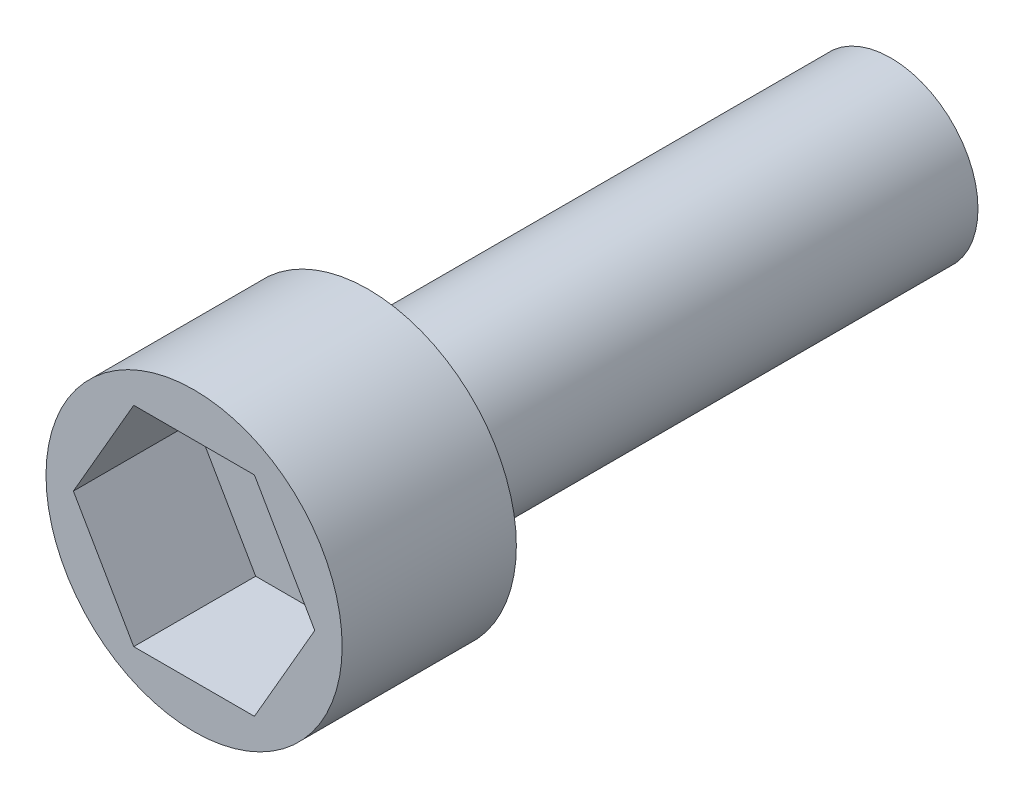
ISO-10303-21;
HEADER;
FILE_DESCRIPTION(('STEP AP214'),'2;1');
FILE_NAME('part.step','',(''),(''),'','','');
FILE_SCHEMA(('AUTOMOTIVE_DESIGN { 1 0 10303 214 1 1 1 1 }'));
ENDSEC;
DATA;
#1=APPLICATION_CONTEXT('core data for automotive mechanical design processes');
#2=APPLICATION_PROTOCOL_DEFINITION('international standard','automotive_design',2000,#1);
#3=PRODUCT_CONTEXT('',#1,'mechanical');
#4=PRODUCT('Part','Part','',(#3));
#5=PRODUCT_RELATED_PRODUCT_CATEGORY('part','',(#4));
#6=PRODUCT_DEFINITION_FORMATION('','',#4);
#7=PRODUCT_DEFINITION_CONTEXT('part definition',#1,'design');
#8=PRODUCT_DEFINITION('design','',#6,#7);
#9=PRODUCT_DEFINITION_SHAPE('','',#8);
#10=(LENGTH_UNIT() NAMED_UNIT(*) SI_UNIT(.MILLI.,.METRE.));
#11=(NAMED_UNIT(*) PLANE_ANGLE_UNIT() SI_UNIT($,.RADIAN.));
#12=(NAMED_UNIT(*) SI_UNIT($,.STERADIAN.) SOLID_ANGLE_UNIT());
#13=UNCERTAINTY_MEASURE_WITH_UNIT(LENGTH_MEASURE(1.E-05),#10,'distance_accuracy_value','');
#14=(GEOMETRIC_REPRESENTATION_CONTEXT(3) GLOBAL_UNCERTAINTY_ASSIGNED_CONTEXT((#13)) GLOBAL_UNIT_ASSIGNED_CONTEXT((#10,
#11,#12)) REPRESENTATION_CONTEXT('',''));
#15=CARTESIAN_POINT('',(0.,0.,0.));
#16=DIRECTION('',(0.,0.,1.));
#17=DIRECTION('',(1.,0.,0.));
#18=AXIS2_PLACEMENT_3D('',#15,#16,#17);
#19=CARTESIAN_POINT('',(0.,0.,15.));
#20=DIRECTION('',(0.,0.,-1.));
#21=DIRECTION('',(-1.,0.,0.));
#22=AXIS2_PLACEMENT_3D('',#19,#20,#21);
#23=CYLINDRICAL_SURFACE('',#22,2.5);
#24=CARTESIAN_POINT('',(0.,0.,15.));
#25=DIRECTION('',(0.,0.,1.));
#26=DIRECTION('',(1.,0.,0.));
#27=AXIS2_PLACEMENT_3D('',#24,#25,#26);
#28=CIRCLE('',#27,2.5);
#29=CARTESIAN_POINT('',(2.5,0.,15.));
#30=VERTEX_POINT('',#29);
#31=EDGE_CURVE('E11',#30,#30,#28,.T.);
#32=ORIENTED_EDGE('',*,*,#31,.F.);
#33=EDGE_LOOP('',(#32));
#34=FACE_BOUND('',#33,.T.);
#35=CARTESIAN_POINT('',(0.,0.,0.));
#36=DIRECTION('',(0.,0.,1.));
#37=DIRECTION('',(1.,0.,0.));
#38=AXIS2_PLACEMENT_3D('',#35,#36,#37);
#39=CIRCLE('',#38,2.5);
#40=CARTESIAN_POINT('',(2.5,0.,0.));
#41=VERTEX_POINT('',#40);
#42=EDGE_CURVE('E44',#41,#41,#39,.T.);
#43=ORIENTED_EDGE('',*,*,#42,.T.);
#44=EDGE_LOOP('',(#43));
#45=FACE_BOUND('',#44,.T.);
#46=ADVANCED_FACE('F41',(#34,#45),#23,.T.);
#47=CARTESIAN_POINT('',(0.,0.,0.));
#48=DIRECTION('',(0.,0.,1.));
#49=DIRECTION('',(1.,0.,0.));
#50=AXIS2_PLACEMENT_3D('',#47,#48,#49);
#51=PLANE('',#50);
#52=ORIENTED_EDGE('',*,*,#42,.F.);
#53=EDGE_LOOP('',(#52));
#54=FACE_BOUND('',#53,.T.);
#55=ADVANCED_FACE('F191',(#54),#51,.F.);
#56=CARTESIAN_POINT('',(0.,0.,20.));
#57=DIRECTION('',(0.,0.,-1.));
#58=DIRECTION('',(-1.,0.,0.));
#59=AXIS2_PLACEMENT_3D('',#56,#57,#58);
#60=CYLINDRICAL_SURFACE('',#59,4.25);
#61=CARTESIAN_POINT('',(0.,0.,20.));
#62=DIRECTION('',(0.,0.,1.));
#63=DIRECTION('',(1.,0.,0.));
#64=AXIS2_PLACEMENT_3D('',#61,#62,#63);
#65=CIRCLE('',#64,4.25);
#66=CARTESIAN_POINT('',(4.25,0.,20.));
#67=VERTEX_POINT('',#66);
#68=EDGE_CURVE('E165',#67,#67,#65,.T.);
#69=ORIENTED_EDGE('',*,*,#68,.F.);
#70=EDGE_LOOP('',(#69));
#71=FACE_BOUND('',#70,.T.);
#72=CARTESIAN_POINT('',(0.,0.,15.));
#73=DIRECTION('',(0.,0.,1.));
#74=DIRECTION('',(1.,0.,0.));
#75=AXIS2_PLACEMENT_3D('',#72,#73,#74);
#76=CIRCLE('',#75,4.25);
#77=CARTESIAN_POINT('',(4.25,0.,15.));
#78=VERTEX_POINT('',#77);
#79=EDGE_CURVE('E155',#78,#78,#76,.T.);
#80=ORIENTED_EDGE('',*,*,#79,.T.);
#81=EDGE_LOOP('',(#80));
#82=FACE_BOUND('',#81,.T.);
#83=ADVANCED_FACE('F173',(#71,#82),#60,.T.);
#84=CARTESIAN_POINT('',(0.,0.,20.));
#85=DIRECTION('',(0.,0.,1.));
#86=DIRECTION('',(1.,0.,0.));
#87=AXIS2_PLACEMENT_3D('',#84,#85,#86);
#88=PLANE('',#87);
#89=DIRECTION('',(0.5,0.866025403784439,0.));
#90=VECTOR('',#89,1.);
#91=CARTESIAN_POINT('',(1.73205080756888,-3.,20.));
#92=LINE('',#91,#90);
#93=CARTESIAN_POINT('',(1.73205080756888,-3.,20.));
#94=VERTEX_POINT('',#93);
#95=CARTESIAN_POINT('',(3.46410161513775,0.,20.));
#96=VERTEX_POINT('',#95);
#97=EDGE_CURVE('E56',#94,#96,#92,.T.);
#98=ORIENTED_EDGE('',*,*,#97,.F.);
#99=DIRECTION('',(1.,0.,0.));
#100=VECTOR('',#99,1.);
#101=CARTESIAN_POINT('',(-1.73205080756888,-3.,20.));
#102=LINE('',#101,#100);
#103=CARTESIAN_POINT('',(-1.73205080756888,-3.,20.));
#104=VERTEX_POINT('',#103);
#105=EDGE_CURVE('E149',#104,#94,#102,.T.);
#106=ORIENTED_EDGE('',*,*,#105,.F.);
#107=DIRECTION('',(0.5,-0.866025403784439,0.));
#108=VECTOR('',#107,1.);
#109=CARTESIAN_POINT('',(-3.46410161513775,0.,20.));
#110=LINE('',#109,#108);
#111=CARTESIAN_POINT('',(-3.46410161513775,0.,20.));
#112=VERTEX_POINT('',#111);
#113=EDGE_CURVE('E146',#112,#104,#110,.T.);
#114=ORIENTED_EDGE('',*,*,#113,.F.);
#115=DIRECTION('',(-0.5,-0.866025403784439,0.));
#116=VECTOR('',#115,1.);
#117=CARTESIAN_POINT('',(-1.73205080756888,3.,20.));
#118=LINE('',#117,#116);
#119=CARTESIAN_POINT('',(-1.73205080756888,3.,20.));
#120=VERTEX_POINT('',#119);
#121=EDGE_CURVE('E104',#120,#112,#118,.T.);
#122=ORIENTED_EDGE('',*,*,#121,.F.);
#123=DIRECTION('',(-1.,0.,0.));
#124=VECTOR('',#123,1.);
#125=CARTESIAN_POINT('',(1.73205080756888,3.,20.));
#126=LINE('',#125,#124);
#127=CARTESIAN_POINT('',(1.73205080756888,3.,20.));
#128=VERTEX_POINT('',#127);
#129=EDGE_CURVE('E140',#128,#120,#126,.T.);
#130=ORIENTED_EDGE('',*,*,#129,.F.);
#131=DIRECTION('',(-0.5,0.866025403784438,0.));
#132=VECTOR('',#131,1.);
#133=CARTESIAN_POINT('',(3.46410161513775,0.,20.));
#134=LINE('',#133,#132);
#135=EDGE_CURVE('E136',#96,#128,#134,.T.);
#136=ORIENTED_EDGE('',*,*,#135,.F.);
#137=EDGE_LOOP('',(#98,#106,#114,#122,#130,#136));
#138=FACE_BOUND('',#137,.T.);
#139=ORIENTED_EDGE('',*,*,#68,.T.);
#140=EDGE_LOOP('',(#139));
#141=FACE_BOUND('',#140,.T.);
#142=ADVANCED_FACE('F178',(#138,#141),#88,.T.);
#143=CARTESIAN_POINT('',(0.,0.,15.));
#144=DIRECTION('',(0.,0.,1.));
#145=DIRECTION('',(1.,0.,0.));
#146=AXIS2_PLACEMENT_3D('',#143,#144,#145);
#147=PLANE('',#146);
#148=ORIENTED_EDGE('',*,*,#31,.T.);
#149=EDGE_LOOP('',(#148));
#150=FACE_BOUND('',#149,.T.);
#151=ORIENTED_EDGE('',*,*,#79,.F.);
#152=EDGE_LOOP('',(#151));
#153=FACE_BOUND('',#152,.T.);
#154=ADVANCED_FACE('F175',(#150,#153),#147,.F.);
#155=CARTESIAN_POINT('',(1.73205080756888,-3.,16.5));
#156=DIRECTION('',(0.866025403784439,-0.5,0.));
#157=DIRECTION('',(0.5,0.866025403784439,0.));
#158=AXIS2_PLACEMENT_3D('',#155,#156,#157);
#159=PLANE('',#158);
#160=ORIENTED_EDGE('',*,*,#97,.T.);
#161=DIRECTION('',(0.,0.,1.));
#162=VECTOR('',#161,1.);
#163=CARTESIAN_POINT('',(3.46410161513775,0.,16.5));
#164=LINE('',#163,#162);
#165=CARTESIAN_POINT('',(3.46410161513775,0.,16.5));
#166=VERTEX_POINT('',#165);
#167=EDGE_CURVE('E86',#166,#96,#164,.T.);
#168=ORIENTED_EDGE('',*,*,#167,.F.);
#169=DIRECTION('',(0.5,0.866025403784439,0.));
#170=VECTOR('',#169,1.);
#171=CARTESIAN_POINT('',(1.73205080756888,-3.,16.5));
#172=LINE('',#171,#170);
#173=CARTESIAN_POINT('',(1.73205080756888,-3.,16.5));
#174=VERTEX_POINT('',#173);
#175=EDGE_CURVE('E152',#174,#166,#172,.T.);
#176=ORIENTED_EDGE('',*,*,#175,.F.);
#177=DIRECTION('',(0.,0.,1.));
#178=VECTOR('',#177,1.);
#179=CARTESIAN_POINT('',(1.73205080756888,-3.,16.5));
#180=LINE('',#179,#178);
#181=EDGE_CURVE('E64',#174,#94,#180,.T.);
#182=ORIENTED_EDGE('',*,*,#181,.T.);
#183=EDGE_LOOP('',(#160,#168,#176,#182));
#184=FACE_BOUND('',#183,.T.);
#185=ADVANCED_FACE('F177',(#184),#159,.F.);
#186=CARTESIAN_POINT('',(-1.73205080756888,-3.,16.5));
#187=DIRECTION('',(0.,-1.,0.));
#188=DIRECTION('',(0.,0.,-1.));
#189=AXIS2_PLACEMENT_3D('',#186,#187,#188);
#190=PLANE('',#189);
#191=ORIENTED_EDGE('',*,*,#105,.T.);
#192=ORIENTED_EDGE('',*,*,#181,.F.);
#193=DIRECTION('',(1.,0.,0.));
#194=VECTOR('',#193,1.);
#195=CARTESIAN_POINT('',(-1.73205080756888,-3.,16.5));
#196=LINE('',#195,#194);
#197=CARTESIAN_POINT('',(-1.73205080756888,-3.,16.5));
#198=VERTEX_POINT('',#197);
#199=EDGE_CURVE('E118',#198,#174,#196,.T.);
#200=ORIENTED_EDGE('',*,*,#199,.F.);
#201=DIRECTION('',(0.,0.,1.));
#202=VECTOR('',#201,1.);
#203=CARTESIAN_POINT('',(-1.73205080756888,-3.,16.5));
#204=LINE('',#203,#202);
#205=EDGE_CURVE('E109',#198,#104,#204,.T.);
#206=ORIENTED_EDGE('',*,*,#205,.T.);
#207=EDGE_LOOP('',(#191,#192,#200,#206));
#208=FACE_BOUND('',#207,.T.);
#209=ADVANCED_FACE('F185',(#208),#190,.F.);
#210=CARTESIAN_POINT('',(-3.46410161513775,0.,16.5));
#211=DIRECTION('',(-0.866025403784439,-0.5,0.));
#212=DIRECTION('',(0.5,-0.866025403784439,0.));
#213=AXIS2_PLACEMENT_3D('',#210,#211,#212);
#214=PLANE('',#213);
#215=ORIENTED_EDGE('',*,*,#113,.T.);
#216=ORIENTED_EDGE('',*,*,#205,.F.);
#217=DIRECTION('',(0.5,-0.866025403784439,0.));
#218=VECTOR('',#217,1.);
#219=CARTESIAN_POINT('',(-3.46410161513775,0.,16.5));
#220=LINE('',#219,#218);
#221=CARTESIAN_POINT('',(-3.46410161513775,0.,16.5));
#222=VERTEX_POINT('',#221);
#223=EDGE_CURVE('E113',#222,#198,#220,.T.);
#224=ORIENTED_EDGE('',*,*,#223,.F.);
#225=DIRECTION('',(0.,0.,1.));
#226=VECTOR('',#225,1.);
#227=CARTESIAN_POINT('',(-3.46410161513775,0.,16.5));
#228=LINE('',#227,#226);
#229=EDGE_CURVE('E97',#222,#112,#228,.T.);
#230=ORIENTED_EDGE('',*,*,#229,.T.);
#231=EDGE_LOOP('',(#215,#216,#224,#230));
#232=FACE_BOUND('',#231,.T.);
#233=ADVANCED_FACE('F114',(#232),#214,.F.);
#234=CARTESIAN_POINT('',(-1.73205080756888,3.,16.5));
#235=DIRECTION('',(-0.866025403784439,0.5,0.));
#236=DIRECTION('',(-0.5,-0.866025403784439,0.));
#237=AXIS2_PLACEMENT_3D('',#234,#235,#236);
#238=PLANE('',#237);
#239=ORIENTED_EDGE('',*,*,#121,.T.);
#240=ORIENTED_EDGE('',*,*,#229,.F.);
#241=DIRECTION('',(-0.5,-0.866025403784439,0.));
#242=VECTOR('',#241,1.);
#243=CARTESIAN_POINT('',(-1.73205080756888,3.,16.5));
#244=LINE('',#243,#242);
#245=CARTESIAN_POINT('',(-1.73205080756888,3.,16.5));
#246=VERTEX_POINT('',#245);
#247=EDGE_CURVE('E101',#246,#222,#244,.T.);
#248=ORIENTED_EDGE('',*,*,#247,.F.);
#249=DIRECTION('',(0.,0.,1.));
#250=VECTOR('',#249,1.);
#251=CARTESIAN_POINT('',(-1.73205080756888,3.,16.5));
#252=LINE('',#251,#250);
#253=EDGE_CURVE('E110',#246,#120,#252,.T.);
#254=ORIENTED_EDGE('',*,*,#253,.T.);
#255=EDGE_LOOP('',(#239,#240,#248,#254));
#256=FACE_BOUND('',#255,.T.);
#257=ADVANCED_FACE('F99',(#256),#238,.F.);
#258=CARTESIAN_POINT('',(1.73205080756888,3.,16.5));
#259=DIRECTION('',(0.,1.,0.));
#260=DIRECTION('',(0.,0.,1.));
#261=AXIS2_PLACEMENT_3D('',#258,#259,#260);
#262=PLANE('',#261);
#263=ORIENTED_EDGE('',*,*,#129,.T.);
#264=ORIENTED_EDGE('',*,*,#253,.F.);
#265=DIRECTION('',(-1.,0.,0.));
#266=VECTOR('',#265,1.);
#267=CARTESIAN_POINT('',(1.73205080756888,3.,16.5));
#268=LINE('',#267,#266);
#269=CARTESIAN_POINT('',(1.73205080756888,3.,16.5));
#270=VERTEX_POINT('',#269);
#271=EDGE_CURVE('E124',#270,#246,#268,.T.);
#272=ORIENTED_EDGE('',*,*,#271,.F.);
#273=DIRECTION('',(0.,0.,1.));
#274=VECTOR('',#273,1.);
#275=CARTESIAN_POINT('',(1.73205080756888,3.,16.5));
#276=LINE('',#275,#274);
#277=EDGE_CURVE('E160',#270,#128,#276,.T.);
#278=ORIENTED_EDGE('',*,*,#277,.T.);
#279=EDGE_LOOP('',(#263,#264,#272,#278));
#280=FACE_BOUND('',#279,.T.);
#281=ADVANCED_FACE('F247',(#280),#262,.F.);
#282=CARTESIAN_POINT('',(3.46410161513775,0.,16.5));
#283=DIRECTION('',(0.866025403784438,0.5,0.));
#284=DIRECTION('',(-0.5,0.866025403784439,0.));
#285=AXIS2_PLACEMENT_3D('',#282,#283,#284);
#286=PLANE('',#285);
#287=ORIENTED_EDGE('',*,*,#135,.T.);
#288=ORIENTED_EDGE('',*,*,#277,.F.);
#289=DIRECTION('',(-0.5,0.866025403784438,0.));
#290=VECTOR('',#289,1.);
#291=CARTESIAN_POINT('',(3.46410161513775,0.,16.5));
#292=LINE('',#291,#290);
#293=EDGE_CURVE('E128',#166,#270,#292,.T.);
#294=ORIENTED_EDGE('',*,*,#293,.F.);
#295=ORIENTED_EDGE('',*,*,#167,.T.);
#296=EDGE_LOOP('',(#287,#288,#294,#295));
#297=FACE_BOUND('',#296,.T.);
#298=ADVANCED_FACE('F256',(#297),#286,.F.);
#299=CARTESIAN_POINT('',(0.,0.,16.5));
#300=DIRECTION('',(0.,0.,1.));
#301=DIRECTION('',(1.,0.,0.));
#302=AXIS2_PLACEMENT_3D('',#299,#300,#301);
#303=PLANE('',#302);
#304=ORIENTED_EDGE('',*,*,#175,.T.);
#305=ORIENTED_EDGE('',*,*,#293,.T.);
#306=ORIENTED_EDGE('',*,*,#271,.T.);
#307=ORIENTED_EDGE('',*,*,#247,.T.);
#308=ORIENTED_EDGE('',*,*,#223,.T.);
#309=ORIENTED_EDGE('',*,*,#199,.T.);
#310=EDGE_LOOP('',(#304,#305,#306,#307,#308,#309));
#311=FACE_BOUND('',#310,.T.);
#312=ADVANCED_FACE('F121',(#311),#303,.T.);
#313=CLOSED_SHELL('',(#46,#55,#83,#142,#154,#185,#209,#233,#257,#281,#298,#312));
#314=MANIFOLD_SOLID_BREP('B2',#313);
#315=ADVANCED_BREP_SHAPE_REPRESENTATION('',(#18,#314),#14);
#316=SHAPE_DEFINITION_REPRESENTATION(#9,#315);
ENDSEC;
END-ISO-10303-21;
